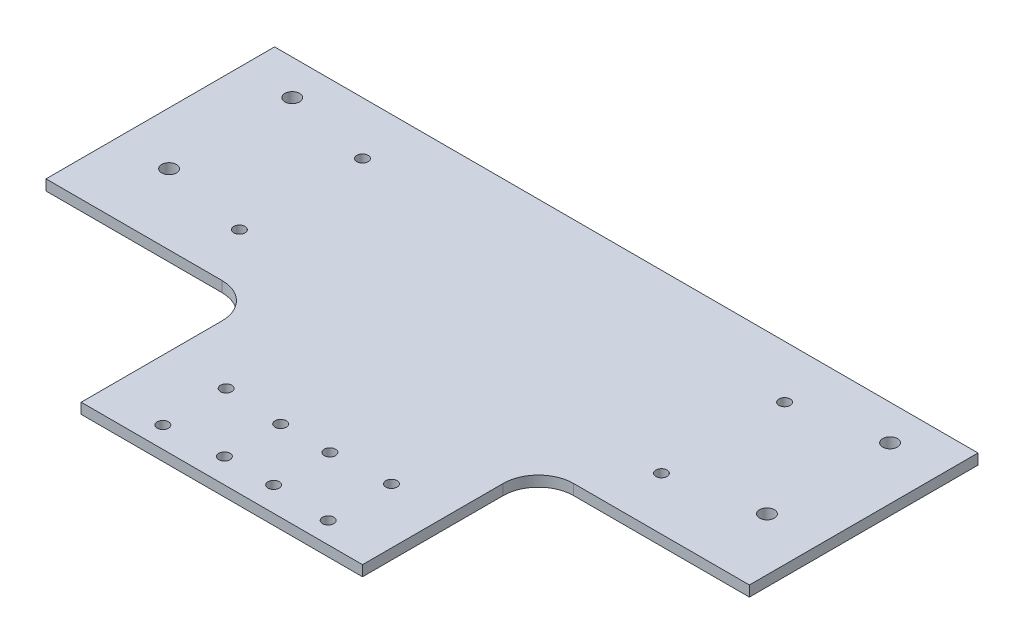
ISO-10303-21;
HEADER;
FILE_DESCRIPTION(('STEP AP214'),'2;1');
FILE_NAME('part.step','',(''),(''),'','','');
FILE_SCHEMA(('AUTOMOTIVE_DESIGN { 1 0 10303 214 1 1 1 1 }'));
ENDSEC;
DATA;
#1=APPLICATION_CONTEXT('core data for automotive mechanical design processes');
#2=APPLICATION_PROTOCOL_DEFINITION('international standard','automotive_design',2000,#1);
#3=PRODUCT_CONTEXT('',#1,'mechanical');
#4=PRODUCT('Part','Part','',(#3));
#5=PRODUCT_RELATED_PRODUCT_CATEGORY('part','',(#4));
#6=PRODUCT_DEFINITION_FORMATION('','',#4);
#7=PRODUCT_DEFINITION_CONTEXT('part definition',#1,'design');
#8=PRODUCT_DEFINITION('design','',#6,#7);
#9=PRODUCT_DEFINITION_SHAPE('','',#8);
#10=(LENGTH_UNIT() NAMED_UNIT(*) SI_UNIT(.MILLI.,.METRE.));
#11=(NAMED_UNIT(*) PLANE_ANGLE_UNIT() SI_UNIT($,.RADIAN.));
#12=(NAMED_UNIT(*) SI_UNIT($,.STERADIAN.) SOLID_ANGLE_UNIT());
#13=UNCERTAINTY_MEASURE_WITH_UNIT(LENGTH_MEASURE(1.E-05),#10,'distance_accuracy_value','');
#14=(GEOMETRIC_REPRESENTATION_CONTEXT(3) GLOBAL_UNCERTAINTY_ASSIGNED_CONTEXT((#13)) GLOBAL_UNIT_ASSIGNED_CONTEXT((#10,
#11,#12)) REPRESENTATION_CONTEXT('',''));
#15=CARTESIAN_POINT('',(0.,0.,0.));
#16=DIRECTION('',(0.,0.,1.));
#17=DIRECTION('',(1.,0.,0.));
#18=AXIS2_PLACEMENT_3D('',#15,#16,#17);
#19=CARTESIAN_POINT('',(0.,3.,32.5));
#20=DIRECTION('',(0.,0.,-1.));
#21=DIRECTION('',(-1.,0.,0.));
#22=AXIS2_PLACEMENT_3D('',#19,#20,#21);
#23=PLANE('',#22);
#24=DIRECTION('',(1.,0.,0.));
#25=VECTOR('',#24,1.);
#26=CARTESIAN_POINT('',(0.,0.,32.5));
#27=LINE('',#26,#25);
#28=CARTESIAN_POINT('',(-100.,0.,32.5));
#29=VERTEX_POINT('',#28);
#30=CARTESIAN_POINT('',(-50.,0.,32.5));
#31=VERTEX_POINT('',#30);
#32=EDGE_CURVE('E168',#29,#31,#27,.T.);
#33=ORIENTED_EDGE('',*,*,#32,.T.);
#34=DIRECTION('',(0.,-1.,0.));
#35=VECTOR('',#34,1.);
#36=CARTESIAN_POINT('',(-50.,3.,32.5));
#37=LINE('',#36,#35);
#38=CARTESIAN_POINT('',(-50.,3.,32.5));
#39=VERTEX_POINT('',#38);
#40=EDGE_CURVE('E52',#31,#39,#37,.F.);
#41=ORIENTED_EDGE('',*,*,#40,.T.);
#42=DIRECTION('',(1.,0.,0.));
#43=VECTOR('',#42,1.);
#44=CARTESIAN_POINT('',(0.,3.,32.5));
#45=LINE('',#44,#43);
#46=CARTESIAN_POINT('',(-100.,3.,32.5));
#47=VERTEX_POINT('',#46);
#48=EDGE_CURVE('E126',#47,#39,#45,.T.);
#49=ORIENTED_EDGE('',*,*,#48,.F.);
#50=DIRECTION('',(0.,-1.,0.));
#51=VECTOR('',#50,1.);
#52=CARTESIAN_POINT('',(-100.,3.,32.5));
#53=LINE('',#52,#51);
#54=EDGE_CURVE('E157',#47,#29,#53,.T.);
#55=ORIENTED_EDGE('',*,*,#54,.T.);
#56=EDGE_LOOP('',(#33,#41,#49,#55));
#57=FACE_BOUND('',#56,.T.);
#58=ADVANCED_FACE('F37',(#57),#23,.F.);
#59=CARTESIAN_POINT('',(-40.,3.,0.));
#60=DIRECTION('',(1.,0.,0.));
#61=DIRECTION('',(0.,0.,-1.));
#62=AXIS2_PLACEMENT_3D('',#59,#60,#61);
#63=PLANE('',#62);
#64=DIRECTION('',(0.,0.,1.));
#65=VECTOR('',#64,1.);
#66=CARTESIAN_POINT('',(-40.,3.,0.));
#67=LINE('',#66,#65);
#68=CARTESIAN_POINT('',(-40.,3.,42.5));
#69=VERTEX_POINT('',#68);
#70=CARTESIAN_POINT('',(-39.9999999999999,3.,82.5));
#71=VERTEX_POINT('',#70);
#72=EDGE_CURVE('E114',#69,#71,#67,.T.);
#73=ORIENTED_EDGE('',*,*,#72,.F.);
#74=DIRECTION('',(0.,-1.,0.));
#75=VECTOR('',#74,1.);
#76=CARTESIAN_POINT('',(-40.,0.,42.5));
#77=LINE('',#76,#75);
#78=CARTESIAN_POINT('',(-40.,0.,42.5));
#79=VERTEX_POINT('',#78);
#80=EDGE_CURVE('E202',#69,#79,#77,.T.);
#81=ORIENTED_EDGE('',*,*,#80,.T.);
#82=DIRECTION('',(0.,0.,1.));
#83=VECTOR('',#82,1.);
#84=CARTESIAN_POINT('',(-40.,0.,0.));
#85=LINE('',#84,#83);
#86=CARTESIAN_POINT('',(-39.9999999999999,0.,82.5));
#87=VERTEX_POINT('',#86);
#88=EDGE_CURVE('E131',#79,#87,#85,.T.);
#89=ORIENTED_EDGE('',*,*,#88,.T.);
#90=DIRECTION('',(0.,-1.,0.));
#91=VECTOR('',#90,1.);
#92=CARTESIAN_POINT('',(-39.9999999999999,3.,82.5));
#93=LINE('',#92,#91);
#94=EDGE_CURVE('E129',#71,#87,#93,.T.);
#95=ORIENTED_EDGE('',*,*,#94,.F.);
#96=EDGE_LOOP('',(#73,#81,#89,#95));
#97=FACE_BOUND('',#96,.T.);
#98=ADVANCED_FACE('F130',(#97),#63,.F.);
#99=CARTESIAN_POINT('',(0.,3.,82.5));
#100=DIRECTION('',(0.,0.,-1.));
#101=DIRECTION('',(-1.,0.,0.));
#102=AXIS2_PLACEMENT_3D('',#99,#100,#101);
#103=PLANE('',#102);
#104=DIRECTION('',(1.,0.,0.));
#105=VECTOR('',#104,1.);
#106=CARTESIAN_POINT('',(0.,0.,82.5));
#107=LINE('',#106,#105);
#108=CARTESIAN_POINT('',(40.0000000000001,0.,82.5));
#109=VERTEX_POINT('',#108);
#110=EDGE_CURVE('E172',#87,#109,#107,.T.);
#111=ORIENTED_EDGE('',*,*,#110,.T.);
#112=DIRECTION('',(0.,-1.,0.));
#113=VECTOR('',#112,1.);
#114=CARTESIAN_POINT('',(40.0000000000001,3.,82.5));
#115=LINE('',#114,#113);
#116=CARTESIAN_POINT('',(40.0000000000001,3.,82.5));
#117=VERTEX_POINT('',#116);
#118=EDGE_CURVE('E136',#117,#109,#115,.T.);
#119=ORIENTED_EDGE('',*,*,#118,.F.);
#120=DIRECTION('',(1.,0.,0.));
#121=VECTOR('',#120,1.);
#122=CARTESIAN_POINT('',(0.,3.,82.5));
#123=LINE('',#122,#121);
#124=EDGE_CURVE('E120',#71,#117,#123,.T.);
#125=ORIENTED_EDGE('',*,*,#124,.F.);
#126=ORIENTED_EDGE('',*,*,#94,.T.);
#127=EDGE_LOOP('',(#111,#119,#125,#126));
#128=FACE_BOUND('',#127,.T.);
#129=ADVANCED_FACE('F138',(#128),#103,.F.);
#130=CARTESIAN_POINT('',(39.9999999999999,3.,0.));
#131=DIRECTION('',(1.,0.,0.));
#132=DIRECTION('',(0.,0.,-1.));
#133=AXIS2_PLACEMENT_3D('',#130,#131,#132);
#134=PLANE('',#133);
#135=DIRECTION('',(0.,0.,1.));
#136=VECTOR('',#135,1.);
#137=CARTESIAN_POINT('',(39.9999999999999,0.,0.));
#138=LINE('',#137,#136);
#139=CARTESIAN_POINT('',(40.,0.,42.5));
#140=VERTEX_POINT('',#139);
#141=EDGE_CURVE('E174',#140,#109,#138,.T.);
#142=ORIENTED_EDGE('',*,*,#141,.F.);
#143=DIRECTION('',(0.,-1.,0.));
#144=VECTOR('',#143,1.);
#145=CARTESIAN_POINT('',(40.,3.,42.5));
#146=LINE('',#145,#144);
#147=CARTESIAN_POINT('',(40.,3.,42.5));
#148=VERTEX_POINT('',#147);
#149=EDGE_CURVE('E200',#140,#148,#146,.F.);
#150=ORIENTED_EDGE('',*,*,#149,.T.);
#151=DIRECTION('',(0.,0.,1.));
#152=VECTOR('',#151,1.);
#153=CARTESIAN_POINT('',(39.9999999999999,3.,0.));
#154=LINE('',#153,#152);
#155=EDGE_CURVE('E140',#148,#117,#154,.T.);
#156=ORIENTED_EDGE('',*,*,#155,.T.);
#157=ORIENTED_EDGE('',*,*,#118,.T.);
#158=EDGE_LOOP('',(#142,#150,#156,#157));
#159=FACE_BOUND('',#158,.T.);
#160=ADVANCED_FACE('F224',(#159),#134,.T.);
#161=CARTESIAN_POINT('',(50.,3.,32.5));
#162=VERTEX_POINT('',#161);
#163=CARTESIAN_POINT('',(100.,3.,32.5));
#164=VERTEX_POINT('',#163);
#165=EDGE_CURVE('E142',#162,#164,#45,.T.);
#166=ORIENTED_EDGE('',*,*,#165,.F.);
#167=DIRECTION('',(0.,-1.,0.));
#168=VECTOR('',#167,1.);
#169=CARTESIAN_POINT('',(50.,3.,32.5));
#170=LINE('',#169,#168);
#171=CARTESIAN_POINT('',(50.,0.,32.5));
#172=VERTEX_POINT('',#171);
#173=EDGE_CURVE('E135',#162,#172,#170,.T.);
#174=ORIENTED_EDGE('',*,*,#173,.T.);
#175=CARTESIAN_POINT('',(100.,0.,32.5));
#176=VERTEX_POINT('',#175);
#177=EDGE_CURVE('E170',#172,#176,#27,.T.);
#178=ORIENTED_EDGE('',*,*,#177,.T.);
#179=DIRECTION('',(0.,-1.,0.));
#180=VECTOR('',#179,1.);
#181=CARTESIAN_POINT('',(100.,3.,32.5));
#182=LINE('',#181,#180);
#183=EDGE_CURVE('E194',#164,#176,#182,.T.);
#184=ORIENTED_EDGE('',*,*,#183,.F.);
#185=EDGE_LOOP('',(#166,#174,#178,#184));
#186=FACE_BOUND('',#185,.T.);
#187=ADVANCED_FACE('F215',(#186),#23,.F.);
#188=CARTESIAN_POINT('',(100.,3.,0.));
#189=DIRECTION('',(-1.,0.,0.));
#190=DIRECTION('',(0.,0.,1.));
#191=AXIS2_PLACEMENT_3D('',#188,#189,#190);
#192=PLANE('',#191);
#193=DIRECTION('',(0.,0.,-1.));
#194=VECTOR('',#193,1.);
#195=CARTESIAN_POINT('',(100.,0.,0.));
#196=LINE('',#195,#194);
#197=CARTESIAN_POINT('',(100.,0.,-32.5));
#198=VERTEX_POINT('',#197);
#199=EDGE_CURVE('E176',#176,#198,#196,.T.);
#200=ORIENTED_EDGE('',*,*,#199,.T.);
#201=DIRECTION('',(0.,-1.,0.));
#202=VECTOR('',#201,1.);
#203=CARTESIAN_POINT('',(100.,3.,-32.5));
#204=LINE('',#203,#202);
#205=CARTESIAN_POINT('',(100.,3.,-32.5));
#206=VERTEX_POINT('',#205);
#207=EDGE_CURVE('E192',#206,#198,#204,.T.);
#208=ORIENTED_EDGE('',*,*,#207,.F.);
#209=DIRECTION('',(0.,0.,-1.));
#210=VECTOR('',#209,1.);
#211=CARTESIAN_POINT('',(100.,3.,0.));
#212=LINE('',#211,#210);
#213=EDGE_CURVE('E146',#164,#206,#212,.T.);
#214=ORIENTED_EDGE('',*,*,#213,.F.);
#215=ORIENTED_EDGE('',*,*,#183,.T.);
#216=EDGE_LOOP('',(#200,#208,#214,#215));
#217=FACE_BOUND('',#216,.T.);
#218=ADVANCED_FACE('F231',(#217),#192,.F.);
#219=CARTESIAN_POINT('',(0.,3.,-32.5));
#220=DIRECTION('',(0.,0.,-1.));
#221=DIRECTION('',(-1.,0.,0.));
#222=AXIS2_PLACEMENT_3D('',#219,#220,#221);
#223=PLANE('',#222);
#224=DIRECTION('',(1.,0.,0.));
#225=VECTOR('',#224,1.);
#226=CARTESIAN_POINT('',(0.,0.,-32.5));
#227=LINE('',#226,#225);
#228=CARTESIAN_POINT('',(-100.,0.,-32.5));
#229=VERTEX_POINT('',#228);
#230=EDGE_CURVE('E179',#229,#198,#227,.T.);
#231=ORIENTED_EDGE('',*,*,#230,.F.);
#232=DIRECTION('',(0.,-1.,0.));
#233=VECTOR('',#232,1.);
#234=CARTESIAN_POINT('',(-100.,3.,-32.5));
#235=LINE('',#234,#233);
#236=CARTESIAN_POINT('',(-100.,3.,-32.5));
#237=VERTEX_POINT('',#236);
#238=EDGE_CURVE('E190',#237,#229,#235,.T.);
#239=ORIENTED_EDGE('',*,*,#238,.F.);
#240=DIRECTION('',(1.,0.,0.));
#241=VECTOR('',#240,1.);
#242=CARTESIAN_POINT('',(0.,3.,-32.5));
#243=LINE('',#242,#241);
#244=EDGE_CURVE('E148',#237,#206,#243,.T.);
#245=ORIENTED_EDGE('',*,*,#244,.T.);
#246=ORIENTED_EDGE('',*,*,#207,.T.);
#247=EDGE_LOOP('',(#231,#239,#245,#246));
#248=FACE_BOUND('',#247,.T.);
#249=ADVANCED_FACE('F242',(#248),#223,.T.);
#250=CARTESIAN_POINT('',(-100.,3.,0.));
#251=DIRECTION('',(-1.,0.,0.));
#252=DIRECTION('',(0.,0.,1.));
#253=AXIS2_PLACEMENT_3D('',#250,#251,#252);
#254=PLANE('',#253);
#255=DIRECTION('',(0.,0.,-1.));
#256=VECTOR('',#255,1.);
#257=CARTESIAN_POINT('',(-100.,0.,0.));
#258=LINE('',#257,#256);
#259=EDGE_CURVE('E182',#29,#229,#258,.T.);
#260=ORIENTED_EDGE('',*,*,#259,.F.);
#261=ORIENTED_EDGE('',*,*,#54,.F.);
#262=DIRECTION('',(0.,0.,-1.));
#263=VECTOR('',#262,1.);
#264=CARTESIAN_POINT('',(-100.,3.,0.));
#265=LINE('',#264,#263);
#266=EDGE_CURVE('E151',#47,#237,#265,.T.);
#267=ORIENTED_EDGE('',*,*,#266,.T.);
#268=ORIENTED_EDGE('',*,*,#238,.T.);
#269=EDGE_LOOP('',(#260,#261,#267,#268));
#270=FACE_BOUND('',#269,.T.);
#271=ADVANCED_FACE('F246',(#270),#254,.T.);
#272=CARTESIAN_POINT('',(-85.,3.,-22.5));
#273=DIRECTION('',(0.,-1.,0.));
#274=DIRECTION('',(0.,0.,-1.));
#275=AXIS2_PLACEMENT_3D('',#272,#273,#274);
#276=CYLINDRICAL_SURFACE('',#275,2.1);
#277=CARTESIAN_POINT('',(-85.,3.,-22.5));
#278=DIRECTION('',(0.,1.,0.));
#279=DIRECTION('',(0.,0.,1.));
#280=AXIS2_PLACEMENT_3D('',#277,#278,#279);
#281=CIRCLE('',#280,2.1);
#282=CARTESIAN_POINT('',(-85.,3.,-20.4));
#283=VERTEX_POINT('',#282);
#284=EDGE_CURVE('E393',#283,#283,#281,.T.);
#285=ORIENTED_EDGE('',*,*,#284,.T.);
#286=EDGE_LOOP('',(#285));
#287=FACE_BOUND('',#286,.T.);
#288=CARTESIAN_POINT('',(-85.,0.,-22.5));
#289=DIRECTION('',(0.,1.,0.));
#290=DIRECTION('',(0.,0.,1.));
#291=AXIS2_PLACEMENT_3D('',#288,#289,#290);
#292=CIRCLE('',#291,2.1);
#293=CARTESIAN_POINT('',(-85.,0.,-20.4));
#294=VERTEX_POINT('',#293);
#295=EDGE_CURVE('E165',#294,#294,#292,.T.);
#296=ORIENTED_EDGE('',*,*,#295,.F.);
#297=EDGE_LOOP('',(#296));
#298=FACE_BOUND('',#297,.T.);
#299=ADVANCED_FACE('F250',(#287,#298),#276,.F.);
#300=CARTESIAN_POINT('',(-85.,3.,12.5));
#301=DIRECTION('',(0.,-1.,0.));
#302=DIRECTION('',(0.,0.,-1.));
#303=AXIS2_PLACEMENT_3D('',#300,#301,#302);
#304=CYLINDRICAL_SURFACE('',#303,2.1);
#305=CARTESIAN_POINT('',(-85.,3.,12.5));
#306=DIRECTION('',(0.,1.,0.));
#307=DIRECTION('',(0.,0.,1.));
#308=AXIS2_PLACEMENT_3D('',#305,#306,#307);
#309=CIRCLE('',#308,2.1);
#310=CARTESIAN_POINT('',(-85.,3.,14.6));
#311=VERTEX_POINT('',#310);
#312=EDGE_CURVE('E390',#311,#311,#309,.T.);
#313=ORIENTED_EDGE('',*,*,#312,.T.);
#314=EDGE_LOOP('',(#313));
#315=FACE_BOUND('',#314,.T.);
#316=CARTESIAN_POINT('',(-85.,0.,12.5));
#317=DIRECTION('',(0.,1.,0.));
#318=DIRECTION('',(0.,0.,1.));
#319=AXIS2_PLACEMENT_3D('',#316,#317,#318);
#320=CIRCLE('',#319,2.1);
#321=CARTESIAN_POINT('',(-85.,0.,14.6));
#322=VERTEX_POINT('',#321);
#323=EDGE_CURVE('E161',#322,#322,#320,.T.);
#324=ORIENTED_EDGE('',*,*,#323,.F.);
#325=EDGE_LOOP('',(#324));
#326=FACE_BOUND('',#325,.T.);
#327=ADVANCED_FACE('F407',(#315,#326),#304,.F.);
#328=CARTESIAN_POINT('',(85.,3.,12.5));
#329=DIRECTION('',(0.,-1.,0.));
#330=DIRECTION('',(0.,0.,-1.));
#331=AXIS2_PLACEMENT_3D('',#328,#329,#330);
#332=CYLINDRICAL_SURFACE('',#331,2.1);
#333=CARTESIAN_POINT('',(85.,3.,12.5));
#334=DIRECTION('',(0.,1.,0.));
#335=DIRECTION('',(0.,0.,1.));
#336=AXIS2_PLACEMENT_3D('',#333,#334,#335);
#337=CIRCLE('',#336,2.1);
#338=CARTESIAN_POINT('',(85.,3.,14.6));
#339=VERTEX_POINT('',#338);
#340=EDGE_CURVE('E188',#339,#339,#337,.F.);
#341=ORIENTED_EDGE('',*,*,#340,.F.);
#342=EDGE_LOOP('',(#341));
#343=FACE_BOUND('',#342,.T.);
#344=CARTESIAN_POINT('',(85.,0.,12.5));
#345=DIRECTION('',(0.,1.,0.));
#346=DIRECTION('',(0.,0.,1.));
#347=AXIS2_PLACEMENT_3D('',#344,#345,#346);
#348=CIRCLE('',#347,2.1);
#349=CARTESIAN_POINT('',(85.,0.,14.6));
#350=VERTEX_POINT('',#349);
#351=EDGE_CURVE('E158',#350,#350,#348,.F.);
#352=ORIENTED_EDGE('',*,*,#351,.T.);
#353=EDGE_LOOP('',(#352));
#354=FACE_BOUND('',#353,.T.);
#355=ADVANCED_FACE('F255',(#343,#354),#332,.F.);
#356=CARTESIAN_POINT('',(85.,3.,-22.5));
#357=DIRECTION('',(0.,-1.,0.));
#358=DIRECTION('',(0.,0.,-1.));
#359=AXIS2_PLACEMENT_3D('',#356,#357,#358);
#360=CYLINDRICAL_SURFACE('',#359,2.1);
#361=CARTESIAN_POINT('',(85.,3.,-22.5));
#362=DIRECTION('',(0.,1.,0.));
#363=DIRECTION('',(0.,0.,1.));
#364=AXIS2_PLACEMENT_3D('',#361,#362,#363);
#365=CIRCLE('',#364,2.1);
#366=CARTESIAN_POINT('',(85.,3.,-20.4));
#367=VERTEX_POINT('',#366);
#368=EDGE_CURVE('E154',#367,#367,#365,.F.);
#369=ORIENTED_EDGE('',*,*,#368,.F.);
#370=EDGE_LOOP('',(#369));
#371=FACE_BOUND('',#370,.T.);
#372=CARTESIAN_POINT('',(85.,0.,-22.5));
#373=DIRECTION('',(0.,1.,0.));
#374=DIRECTION('',(0.,0.,1.));
#375=AXIS2_PLACEMENT_3D('',#372,#373,#374);
#376=CIRCLE('',#375,2.1);
#377=CARTESIAN_POINT('',(85.,0.,-20.4));
#378=VERTEX_POINT('',#377);
#379=EDGE_CURVE('E185',#378,#378,#376,.F.);
#380=ORIENTED_EDGE('',*,*,#379,.T.);
#381=EDGE_LOOP('',(#380));
#382=FACE_BOUND('',#381,.T.);
#383=ADVANCED_FACE('F252',(#371,#382),#360,.F.);
#384=CARTESIAN_POINT('',(0.,3.,0.));
#385=DIRECTION('',(0.,1.,0.));
#386=DIRECTION('',(0.,0.,1.));
#387=AXIS2_PLACEMENT_3D('',#384,#385,#386);
#388=PLANE('',#387);
#389=CARTESIAN_POINT('',(-6.27393769836776,3.,75.5));
#390=DIRECTION('',(0.,1.,0.));
#391=DIRECTION('',(0.,0.,-1.));
#392=AXIS2_PLACEMENT_3D('',#389,#390,#391);
#393=CIRCLE('',#392,1.60000000000001);
#394=CARTESIAN_POINT('',(-6.27393769836776,3.,73.9));
#395=VERTEX_POINT('',#394);
#396=EDGE_CURVE('E339',#395,#395,#393,.T.);
#397=ORIENTED_EDGE('',*,*,#396,.F.);
#398=EDGE_LOOP('',(#397));
#399=FACE_BOUND('',#398,.T.);
#400=CARTESIAN_POINT('',(7.72606230163224,3.,75.5));
#401=DIRECTION('',(0.,1.,0.));
#402=DIRECTION('',(0.,0.,1.));
#403=AXIS2_PLACEMENT_3D('',#400,#401,#402);
#404=CIRCLE('',#403,1.6);
#405=CARTESIAN_POINT('',(7.72606230163224,3.,77.1));
#406=VERTEX_POINT('',#405);
#407=EDGE_CURVE('E333',#406,#406,#404,.T.);
#408=ORIENTED_EDGE('',*,*,#407,.F.);
#409=EDGE_LOOP('',(#408));
#410=FACE_BOUND('',#409,.T.);
#411=CARTESIAN_POINT('',(7.72606230163224,3.,59.5));
#412=DIRECTION('',(0.,1.,0.));
#413=DIRECTION('',(0.,0.,-1.));
#414=AXIS2_PLACEMENT_3D('',#411,#412,#413);
#415=CIRCLE('',#414,1.6);
#416=CARTESIAN_POINT('',(7.72606230163224,3.,57.9));
#417=VERTEX_POINT('',#416);
#418=EDGE_CURVE('E325',#417,#417,#415,.T.);
#419=ORIENTED_EDGE('',*,*,#418,.F.);
#420=EDGE_LOOP('',(#419));
#421=FACE_BOUND('',#420,.T.);
#422=CARTESIAN_POINT('',(-6.27393769836776,3.,59.5));
#423=DIRECTION('',(0.,1.,0.));
#424=DIRECTION('',(0.,0.,1.));
#425=AXIS2_PLACEMENT_3D('',#422,#423,#424);
#426=CIRCLE('',#425,1.6);
#427=CARTESIAN_POINT('',(-6.27393769836776,3.,61.1));
#428=VERTEX_POINT('',#427);
#429=EDGE_CURVE('E318',#428,#428,#426,.T.);
#430=ORIENTED_EDGE('',*,*,#429,.F.);
#431=EDGE_LOOP('',(#430));
#432=FACE_BOUND('',#431,.T.);
#433=CARTESIAN_POINT('',(-22.7739376983678,3.,76.5));
#434=DIRECTION('',(0.,1.,0.));
#435=DIRECTION('',(0.,0.,-1.));
#436=AXIS2_PLACEMENT_3D('',#433,#434,#435);
#437=CIRCLE('',#436,1.60000000000001);
#438=CARTESIAN_POINT('',(-22.7739376983678,3.,74.9));
#439=VERTEX_POINT('',#438);
#440=EDGE_CURVE('E322',#439,#439,#437,.T.);
#441=ORIENTED_EDGE('',*,*,#440,.F.);
#442=EDGE_LOOP('',(#441));
#443=FACE_BOUND('',#442,.T.);
#444=CARTESIAN_POINT('',(24.2260623016322,3.,76.5));
#445=DIRECTION('',(0.,1.,0.));
#446=DIRECTION('',(0.,0.,1.));
#447=AXIS2_PLACEMENT_3D('',#444,#445,#446);
#448=CIRCLE('',#447,1.60000000000001);
#449=CARTESIAN_POINT('',(24.2260623016322,3.,78.1));
#450=VERTEX_POINT('',#449);
#451=EDGE_CURVE('E352',#450,#450,#448,.T.);
#452=ORIENTED_EDGE('',*,*,#451,.F.);
#453=EDGE_LOOP('',(#452));
#454=FACE_BOUND('',#453,.T.);
#455=CARTESIAN_POINT('',(24.2260623016322,3.,58.5));
#456=DIRECTION('',(0.,1.,0.));
#457=DIRECTION('',(0.,0.,-1.));
#458=AXIS2_PLACEMENT_3D('',#455,#456,#457);
#459=CIRCLE('',#458,1.6);
#460=CARTESIAN_POINT('',(24.2260623016322,3.,56.9));
#461=VERTEX_POINT('',#460);
#462=EDGE_CURVE('E346',#461,#461,#459,.T.);
#463=ORIENTED_EDGE('',*,*,#462,.F.);
#464=EDGE_LOOP('',(#463));
#465=FACE_BOUND('',#464,.T.);
#466=CARTESIAN_POINT('',(-22.7739376983678,3.,58.5));
#467=DIRECTION('',(0.,1.,0.));
#468=DIRECTION('',(0.,0.,1.));
#469=AXIS2_PLACEMENT_3D('',#466,#467,#468);
#470=CIRCLE('',#469,1.6);
#471=CARTESIAN_POINT('',(-22.7739376983678,3.,60.1));
#472=VERTEX_POINT('',#471);
#473=EDGE_CURVE('E345',#472,#472,#470,.T.);
#474=ORIENTED_EDGE('',*,*,#473,.F.);
#475=EDGE_LOOP('',(#474));
#476=FACE_BOUND('',#475,.T.);
#477=CARTESIAN_POINT('',(-60.,3.,17.5));
#478=DIRECTION('',(0.,1.,0.));
#479=DIRECTION('',(0.,0.,1.));
#480=AXIS2_PLACEMENT_3D('',#477,#478,#479);
#481=CIRCLE('',#480,1.6);
#482=CARTESIAN_POINT('',(-60.,3.,19.1));
#483=VERTEX_POINT('',#482);
#484=EDGE_CURVE('E370',#483,#483,#481,.T.);
#485=ORIENTED_EDGE('',*,*,#484,.F.);
#486=EDGE_LOOP('',(#485));
#487=FACE_BOUND('',#486,.T.);
#488=CARTESIAN_POINT('',(60.,3.,17.5));
#489=DIRECTION('',(0.,1.,0.));
#490=DIRECTION('',(0.,0.,1.));
#491=AXIS2_PLACEMENT_3D('',#488,#489,#490);
#492=CIRCLE('',#491,1.6);
#493=CARTESIAN_POINT('',(60.,3.,19.1));
#494=VERTEX_POINT('',#493);
#495=EDGE_CURVE('E376',#494,#494,#492,.T.);
#496=ORIENTED_EDGE('',*,*,#495,.F.);
#497=EDGE_LOOP('',(#496));
#498=FACE_BOUND('',#497,.T.);
#499=CARTESIAN_POINT('',(60.,3.,-17.5));
#500=DIRECTION('',(0.,1.,0.));
#501=DIRECTION('',(0.,0.,1.));
#502=AXIS2_PLACEMENT_3D('',#499,#500,#501);
#503=CIRCLE('',#502,1.6);
#504=CARTESIAN_POINT('',(60.,3.,-15.9));
#505=VERTEX_POINT('',#504);
#506=EDGE_CURVE('E363',#505,#505,#503,.T.);
#507=ORIENTED_EDGE('',*,*,#506,.F.);
#508=EDGE_LOOP('',(#507));
#509=FACE_BOUND('',#508,.T.);
#510=CARTESIAN_POINT('',(-60.,3.,-17.5));
#511=DIRECTION('',(0.,1.,0.));
#512=DIRECTION('',(0.,0.,1.));
#513=AXIS2_PLACEMENT_3D('',#510,#511,#512);
#514=CIRCLE('',#513,1.6);
#515=CARTESIAN_POINT('',(-60.,3.,-15.9));
#516=VERTEX_POINT('',#515);
#517=EDGE_CURVE('E369',#516,#516,#514,.T.);
#518=ORIENTED_EDGE('',*,*,#517,.F.);
#519=EDGE_LOOP('',(#518));
#520=FACE_BOUND('',#519,.T.);
#521=ORIENTED_EDGE('',*,*,#340,.T.);
#522=EDGE_LOOP('',(#521));
#523=FACE_BOUND('',#522,.T.);
#524=ORIENTED_EDGE('',*,*,#312,.F.);
#525=EDGE_LOOP('',(#524));
#526=FACE_BOUND('',#525,.T.);
#527=ORIENTED_EDGE('',*,*,#284,.F.);
#528=EDGE_LOOP('',(#527));
#529=FACE_BOUND('',#528,.T.);
#530=ORIENTED_EDGE('',*,*,#48,.T.);
#531=CARTESIAN_POINT('',(-50.,3.,42.5));
#532=DIRECTION('',(0.,1.,0.));
#533=DIRECTION('',(0.,0.,1.));
#534=AXIS2_PLACEMENT_3D('',#531,#532,#533);
#535=CIRCLE('',#534,10.);
#536=EDGE_CURVE('E11',#39,#69,#535,.F.);
#537=ORIENTED_EDGE('',*,*,#536,.T.);
#538=ORIENTED_EDGE('',*,*,#72,.T.);
#539=ORIENTED_EDGE('',*,*,#124,.T.);
#540=ORIENTED_EDGE('',*,*,#155,.F.);
#541=CARTESIAN_POINT('',(50.,3.,42.5));
#542=DIRECTION('',(0.,1.,0.));
#543=DIRECTION('',(0.,0.,1.));
#544=AXIS2_PLACEMENT_3D('',#541,#542,#543);
#545=CIRCLE('',#544,10.);
#546=EDGE_CURVE('E207',#148,#162,#545,.F.);
#547=ORIENTED_EDGE('',*,*,#546,.T.);
#548=ORIENTED_EDGE('',*,*,#165,.T.);
#549=ORIENTED_EDGE('',*,*,#213,.T.);
#550=ORIENTED_EDGE('',*,*,#244,.F.);
#551=ORIENTED_EDGE('',*,*,#266,.F.);
#552=EDGE_LOOP('',(#530,#537,#538,#539,#540,#547,#548,#549,#550,#551));
#553=FACE_BOUND('',#552,.T.);
#554=ORIENTED_EDGE('',*,*,#368,.T.);
#555=EDGE_LOOP('',(#554));
#556=FACE_BOUND('',#555,.T.);
#557=ADVANCED_FACE('F116',(#399,#410,#421,#432,#443,#454,#465,#476,#487,#498,#509,#520,#523,
#526,#529,#553,#556),#388,.T.);
#558=CARTESIAN_POINT('',(0.,0.,0.));
#559=DIRECTION('',(0.,1.,0.));
#560=DIRECTION('',(0.,0.,1.));
#561=AXIS2_PLACEMENT_3D('',#558,#559,#560);
#562=PLANE('',#561);
#563=CARTESIAN_POINT('',(-6.27393769836776,0.,75.5));
#564=DIRECTION('',(0.,1.,0.));
#565=DIRECTION('',(0.,0.,-1.));
#566=AXIS2_PLACEMENT_3D('',#563,#564,#565);
#567=CIRCLE('',#566,1.60000000000001);
#568=CARTESIAN_POINT('',(-6.27393769836776,0.,73.9));
#569=VERTEX_POINT('',#568);
#570=EDGE_CURVE('E336',#569,#569,#567,.T.);
#571=ORIENTED_EDGE('',*,*,#570,.T.);
#572=EDGE_LOOP('',(#571));
#573=FACE_BOUND('',#572,.T.);
#574=CARTESIAN_POINT('',(7.72606230163224,0.,75.5));
#575=DIRECTION('',(0.,1.,0.));
#576=DIRECTION('',(0.,0.,1.));
#577=AXIS2_PLACEMENT_3D('',#574,#575,#576);
#578=CIRCLE('',#577,1.6);
#579=CARTESIAN_POINT('',(7.72606230163224,0.,77.1));
#580=VERTEX_POINT('',#579);
#581=EDGE_CURVE('E330',#580,#580,#578,.T.);
#582=ORIENTED_EDGE('',*,*,#581,.T.);
#583=EDGE_LOOP('',(#582));
#584=FACE_BOUND('',#583,.T.);
#585=CARTESIAN_POINT('',(7.72606230163224,0.,59.5));
#586=DIRECTION('',(0.,1.,0.));
#587=DIRECTION('',(0.,0.,-1.));
#588=AXIS2_PLACEMENT_3D('',#585,#586,#587);
#589=CIRCLE('',#588,1.6);
#590=CARTESIAN_POINT('',(7.72606230163224,0.,57.9));
#591=VERTEX_POINT('',#590);
#592=EDGE_CURVE('E320',#591,#591,#589,.T.);
#593=ORIENTED_EDGE('',*,*,#592,.T.);
#594=EDGE_LOOP('',(#593));
#595=FACE_BOUND('',#594,.T.);
#596=CARTESIAN_POINT('',(-6.27393769836776,0.,59.5));
#597=DIRECTION('',(0.,1.,0.));
#598=DIRECTION('',(0.,0.,1.));
#599=AXIS2_PLACEMENT_3D('',#596,#597,#598);
#600=CIRCLE('',#599,1.6);
#601=CARTESIAN_POINT('',(-6.27393769836776,0.,61.1));
#602=VERTEX_POINT('',#601);
#603=EDGE_CURVE('E315',#602,#602,#600,.T.);
#604=ORIENTED_EDGE('',*,*,#603,.T.);
#605=EDGE_LOOP('',(#604));
#606=FACE_BOUND('',#605,.T.);
#607=CARTESIAN_POINT('',(-22.7739376983678,0.,76.5));
#608=DIRECTION('',(0.,1.,0.));
#609=DIRECTION('',(0.,0.,-1.));
#610=AXIS2_PLACEMENT_3D('',#607,#608,#609);
#611=CIRCLE('',#610,1.60000000000001);
#612=CARTESIAN_POINT('',(-22.7739376983678,0.,74.9));
#613=VERTEX_POINT('',#612);
#614=EDGE_CURVE('E355',#613,#613,#611,.T.);
#615=ORIENTED_EDGE('',*,*,#614,.T.);
#616=EDGE_LOOP('',(#615));
#617=FACE_BOUND('',#616,.T.);
#618=CARTESIAN_POINT('',(24.2260623016322,0.,76.5));
#619=DIRECTION('',(0.,1.,0.));
#620=DIRECTION('',(0.,0.,1.));
#621=AXIS2_PLACEMENT_3D('',#618,#619,#620);
#622=CIRCLE('',#621,1.60000000000001);
#623=CARTESIAN_POINT('',(24.2260623016322,0.,78.1));
#624=VERTEX_POINT('',#623);
#625=EDGE_CURVE('E349',#624,#624,#622,.T.);
#626=ORIENTED_EDGE('',*,*,#625,.T.);
#627=EDGE_LOOP('',(#626));
#628=FACE_BOUND('',#627,.T.);
#629=CARTESIAN_POINT('',(24.2260623016322,0.,58.5));
#630=DIRECTION('',(0.,1.,0.));
#631=DIRECTION('',(0.,0.,-1.));
#632=AXIS2_PLACEMENT_3D('',#629,#630,#631);
#633=CIRCLE('',#632,1.6);
#634=CARTESIAN_POINT('',(24.2260623016322,0.,56.9));
#635=VERTEX_POINT('',#634);
#636=EDGE_CURVE('E342',#635,#635,#633,.T.);
#637=ORIENTED_EDGE('',*,*,#636,.T.);
#638=EDGE_LOOP('',(#637));
#639=FACE_BOUND('',#638,.T.);
#640=CARTESIAN_POINT('',(-22.7739376983678,0.,58.5));
#641=DIRECTION('',(0.,1.,0.));
#642=DIRECTION('',(0.,0.,1.));
#643=AXIS2_PLACEMENT_3D('',#640,#641,#642);
#644=CIRCLE('',#643,1.6);
#645=CARTESIAN_POINT('',(-22.7739376983678,0.,60.1));
#646=VERTEX_POINT('',#645);
#647=EDGE_CURVE('E360',#646,#646,#644,.T.);
#648=ORIENTED_EDGE('',*,*,#647,.T.);
#649=EDGE_LOOP('',(#648));
#650=FACE_BOUND('',#649,.T.);
#651=CARTESIAN_POINT('',(-60.,0.,17.5));
#652=DIRECTION('',(0.,1.,0.));
#653=DIRECTION('',(0.,0.,1.));
#654=AXIS2_PLACEMENT_3D('',#651,#652,#653);
#655=CIRCLE('',#654,1.6);
#656=CARTESIAN_POINT('',(-60.,0.,19.1));
#657=VERTEX_POINT('',#656);
#658=EDGE_CURVE('E366',#657,#657,#655,.T.);
#659=ORIENTED_EDGE('',*,*,#658,.T.);
#660=EDGE_LOOP('',(#659));
#661=FACE_BOUND('',#660,.T.);
#662=CARTESIAN_POINT('',(60.,0.,17.5));
#663=DIRECTION('',(0.,1.,0.));
#664=DIRECTION('',(0.,0.,1.));
#665=AXIS2_PLACEMENT_3D('',#662,#663,#664);
#666=CIRCLE('',#665,1.6);
#667=CARTESIAN_POINT('',(60.,0.,19.1));
#668=VERTEX_POINT('',#667);
#669=EDGE_CURVE('E373',#668,#668,#666,.T.);
#670=ORIENTED_EDGE('',*,*,#669,.T.);
#671=EDGE_LOOP('',(#670));
#672=FACE_BOUND('',#671,.T.);
#673=CARTESIAN_POINT('',(60.,0.,-17.5));
#674=DIRECTION('',(0.,1.,0.));
#675=DIRECTION('',(0.,0.,1.));
#676=AXIS2_PLACEMENT_3D('',#673,#674,#675);
#677=CIRCLE('',#676,1.6);
#678=CARTESIAN_POINT('',(60.,0.,-15.9));
#679=VERTEX_POINT('',#678);
#680=EDGE_CURVE('E379',#679,#679,#677,.T.);
#681=ORIENTED_EDGE('',*,*,#680,.T.);
#682=EDGE_LOOP('',(#681));
#683=FACE_BOUND('',#682,.T.);
#684=CARTESIAN_POINT('',(-60.,0.,-17.5));
#685=DIRECTION('',(0.,1.,0.));
#686=DIRECTION('',(0.,0.,1.));
#687=AXIS2_PLACEMENT_3D('',#684,#685,#686);
#688=CIRCLE('',#687,1.6);
#689=CARTESIAN_POINT('',(-60.,0.,-15.9));
#690=VERTEX_POINT('',#689);
#691=EDGE_CURVE('E162',#690,#690,#688,.T.);
#692=ORIENTED_EDGE('',*,*,#691,.T.);
#693=EDGE_LOOP('',(#692));
#694=FACE_BOUND('',#693,.T.);
#695=ORIENTED_EDGE('',*,*,#351,.F.);
#696=EDGE_LOOP('',(#695));
#697=FACE_BOUND('',#696,.T.);
#698=ORIENTED_EDGE('',*,*,#323,.T.);
#699=EDGE_LOOP('',(#698));
#700=FACE_BOUND('',#699,.T.);
#701=ORIENTED_EDGE('',*,*,#295,.T.);
#702=EDGE_LOOP('',(#701));
#703=FACE_BOUND('',#702,.T.);
#704=ORIENTED_EDGE('',*,*,#32,.F.);
#705=ORIENTED_EDGE('',*,*,#259,.T.);
#706=ORIENTED_EDGE('',*,*,#230,.T.);
#707=ORIENTED_EDGE('',*,*,#199,.F.);
#708=ORIENTED_EDGE('',*,*,#177,.F.);
#709=CARTESIAN_POINT('',(50.,0.,42.5));
#710=DIRECTION('',(0.,1.,0.));
#711=DIRECTION('',(0.,0.,1.));
#712=AXIS2_PLACEMENT_3D('',#709,#710,#711);
#713=CIRCLE('',#712,10.);
#714=EDGE_CURVE('E205',#172,#140,#713,.T.);
#715=ORIENTED_EDGE('',*,*,#714,.T.);
#716=ORIENTED_EDGE('',*,*,#141,.T.);
#717=ORIENTED_EDGE('',*,*,#110,.F.);
#718=ORIENTED_EDGE('',*,*,#88,.F.);
#719=CARTESIAN_POINT('',(-50.,0.,42.5));
#720=DIRECTION('',(0.,1.,0.));
#721=DIRECTION('',(0.,0.,1.));
#722=AXIS2_PLACEMENT_3D('',#719,#720,#721);
#723=CIRCLE('',#722,10.);
#724=EDGE_CURVE('E45',#79,#31,#723,.T.);
#725=ORIENTED_EDGE('',*,*,#724,.T.);
#726=EDGE_LOOP('',(#704,#705,#706,#707,#708,#715,#716,#717,#718,#725));
#727=FACE_BOUND('',#726,.T.);
#728=ORIENTED_EDGE('',*,*,#379,.F.);
#729=EDGE_LOOP('',(#728));
#730=FACE_BOUND('',#729,.T.);
#731=ADVANCED_FACE('F220',(#573,#584,#595,#606,#617,#628,#639,#650,#661,#672,#683,#694,#697,
#700,#703,#727,#730),#562,.F.);
#732=CARTESIAN_POINT('',(-60.,0.,-17.5));
#733=DIRECTION('',(0.,1.,0.));
#734=DIRECTION('',(0.,0.,1.));
#735=AXIS2_PLACEMENT_3D('',#732,#733,#734);
#736=CYLINDRICAL_SURFACE('',#735,1.6);
#737=ORIENTED_EDGE('',*,*,#691,.F.);
#738=EDGE_LOOP('',(#737));
#739=FACE_BOUND('',#738,.T.);
#740=ORIENTED_EDGE('',*,*,#517,.T.);
#741=EDGE_LOOP('',(#740));
#742=FACE_BOUND('',#741,.T.);
#743=ADVANCED_FACE('F259',(#739,#742),#736,.F.);
#744=CARTESIAN_POINT('',(60.,0.,-17.5));
#745=DIRECTION('',(0.,1.,0.));
#746=DIRECTION('',(0.,0.,1.));
#747=AXIS2_PLACEMENT_3D('',#744,#745,#746);
#748=CYLINDRICAL_SURFACE('',#747,1.6);
#749=ORIENTED_EDGE('',*,*,#680,.F.);
#750=EDGE_LOOP('',(#749));
#751=FACE_BOUND('',#750,.T.);
#752=ORIENTED_EDGE('',*,*,#506,.T.);
#753=EDGE_LOOP('',(#752));
#754=FACE_BOUND('',#753,.T.);
#755=ADVANCED_FACE('F266',(#751,#754),#748,.F.);
#756=CARTESIAN_POINT('',(60.,0.,17.5));
#757=DIRECTION('',(0.,1.,0.));
#758=DIRECTION('',(0.,0.,1.));
#759=AXIS2_PLACEMENT_3D('',#756,#757,#758);
#760=CYLINDRICAL_SURFACE('',#759,1.6);
#761=ORIENTED_EDGE('',*,*,#669,.F.);
#762=EDGE_LOOP('',(#761));
#763=FACE_BOUND('',#762,.T.);
#764=ORIENTED_EDGE('',*,*,#495,.T.);
#765=EDGE_LOOP('',(#764));
#766=FACE_BOUND('',#765,.T.);
#767=ADVANCED_FACE('F270',(#763,#766),#760,.F.);
#768=CARTESIAN_POINT('',(-60.,0.,17.5));
#769=DIRECTION('',(0.,1.,0.));
#770=DIRECTION('',(0.,0.,1.));
#771=AXIS2_PLACEMENT_3D('',#768,#769,#770);
#772=CYLINDRICAL_SURFACE('',#771,1.6);
#773=ORIENTED_EDGE('',*,*,#658,.F.);
#774=EDGE_LOOP('',(#773));
#775=FACE_BOUND('',#774,.T.);
#776=ORIENTED_EDGE('',*,*,#484,.T.);
#777=EDGE_LOOP('',(#776));
#778=FACE_BOUND('',#777,.T.);
#779=ADVANCED_FACE('F274',(#775,#778),#772,.F.);
#780=CARTESIAN_POINT('',(-22.7739376983678,0.,58.5));
#781=DIRECTION('',(0.,1.,0.));
#782=DIRECTION('',(0.,0.,1.));
#783=AXIS2_PLACEMENT_3D('',#780,#781,#782);
#784=CYLINDRICAL_SURFACE('',#783,1.6);
#785=ORIENTED_EDGE('',*,*,#647,.F.);
#786=EDGE_LOOP('',(#785));
#787=FACE_BOUND('',#786,.T.);
#788=ORIENTED_EDGE('',*,*,#473,.T.);
#789=EDGE_LOOP('',(#788));
#790=FACE_BOUND('',#789,.T.);
#791=ADVANCED_FACE('F278',(#787,#790),#784,.F.);
#792=CARTESIAN_POINT('',(24.2260623016322,0.,58.5));
#793=DIRECTION('',(0.,1.,0.));
#794=DIRECTION('',(0.,0.,1.));
#795=AXIS2_PLACEMENT_3D('',#792,#793,#794);
#796=CYLINDRICAL_SURFACE('',#795,1.6);
#797=ORIENTED_EDGE('',*,*,#636,.F.);
#798=EDGE_LOOP('',(#797));
#799=FACE_BOUND('',#798,.T.);
#800=ORIENTED_EDGE('',*,*,#462,.T.);
#801=EDGE_LOOP('',(#800));
#802=FACE_BOUND('',#801,.T.);
#803=ADVANCED_FACE('F282',(#799,#802),#796,.F.);
#804=CARTESIAN_POINT('',(24.2260623016322,0.,76.5));
#805=DIRECTION('',(0.,1.,0.));
#806=DIRECTION('',(0.,0.,1.));
#807=AXIS2_PLACEMENT_3D('',#804,#805,#806);
#808=CYLINDRICAL_SURFACE('',#807,1.60000000000001);
#809=ORIENTED_EDGE('',*,*,#625,.F.);
#810=EDGE_LOOP('',(#809));
#811=FACE_BOUND('',#810,.T.);
#812=ORIENTED_EDGE('',*,*,#451,.T.);
#813=EDGE_LOOP('',(#812));
#814=FACE_BOUND('',#813,.T.);
#815=ADVANCED_FACE('F288',(#811,#814),#808,.F.);
#816=CARTESIAN_POINT('',(-22.7739376983678,0.,76.5));
#817=DIRECTION('',(0.,1.,0.));
#818=DIRECTION('',(0.,0.,1.));
#819=AXIS2_PLACEMENT_3D('',#816,#817,#818);
#820=CYLINDRICAL_SURFACE('',#819,1.60000000000001);
#821=ORIENTED_EDGE('',*,*,#614,.F.);
#822=EDGE_LOOP('',(#821));
#823=FACE_BOUND('',#822,.T.);
#824=ORIENTED_EDGE('',*,*,#440,.T.);
#825=EDGE_LOOP('',(#824));
#826=FACE_BOUND('',#825,.T.);
#827=ADVANCED_FACE('F284',(#823,#826),#820,.F.);
#828=CARTESIAN_POINT('',(-6.27393769836776,0.,59.5));
#829=DIRECTION('',(0.,1.,0.));
#830=DIRECTION('',(0.,0.,1.));
#831=AXIS2_PLACEMENT_3D('',#828,#829,#830);
#832=CYLINDRICAL_SURFACE('',#831,1.6);
#833=ORIENTED_EDGE('',*,*,#603,.F.);
#834=EDGE_LOOP('',(#833));
#835=FACE_BOUND('',#834,.T.);
#836=ORIENTED_EDGE('',*,*,#429,.T.);
#837=EDGE_LOOP('',(#836));
#838=FACE_BOUND('',#837,.T.);
#839=ADVANCED_FACE('F287',(#835,#838),#832,.F.);
#840=CARTESIAN_POINT('',(7.72606230163224,0.,59.5));
#841=DIRECTION('',(0.,1.,0.));
#842=DIRECTION('',(0.,0.,1.));
#843=AXIS2_PLACEMENT_3D('',#840,#841,#842);
#844=CYLINDRICAL_SURFACE('',#843,1.6);
#845=ORIENTED_EDGE('',*,*,#592,.F.);
#846=EDGE_LOOP('',(#845));
#847=FACE_BOUND('',#846,.T.);
#848=ORIENTED_EDGE('',*,*,#418,.T.);
#849=EDGE_LOOP('',(#848));
#850=FACE_BOUND('',#849,.T.);
#851=ADVANCED_FACE('F303',(#847,#850),#844,.F.);
#852=CARTESIAN_POINT('',(7.72606230163224,0.,75.5));
#853=DIRECTION('',(0.,1.,0.));
#854=DIRECTION('',(0.,0.,1.));
#855=AXIS2_PLACEMENT_3D('',#852,#853,#854);
#856=CYLINDRICAL_SURFACE('',#855,1.6);
#857=ORIENTED_EDGE('',*,*,#581,.F.);
#858=EDGE_LOOP('',(#857));
#859=FACE_BOUND('',#858,.T.);
#860=ORIENTED_EDGE('',*,*,#407,.T.);
#861=EDGE_LOOP('',(#860));
#862=FACE_BOUND('',#861,.T.);
#863=ADVANCED_FACE('F299',(#859,#862),#856,.F.);
#864=CARTESIAN_POINT('',(-6.27393769836776,0.,75.5));
#865=DIRECTION('',(0.,1.,0.));
#866=DIRECTION('',(0.,0.,1.));
#867=AXIS2_PLACEMENT_3D('',#864,#865,#866);
#868=CYLINDRICAL_SURFACE('',#867,1.60000000000001);
#869=ORIENTED_EDGE('',*,*,#570,.F.);
#870=EDGE_LOOP('',(#869));
#871=FACE_BOUND('',#870,.T.);
#872=ORIENTED_EDGE('',*,*,#396,.T.);
#873=EDGE_LOOP('',(#872));
#874=FACE_BOUND('',#873,.T.);
#875=ADVANCED_FACE('F296',(#871,#874),#868,.F.);
#876=CARTESIAN_POINT('',(50.,3.,42.5));
#877=DIRECTION('',(0.,-1.,0.));
#878=DIRECTION('',(0.,0.,-1.));
#879=AXIS2_PLACEMENT_3D('',#876,#877,#878);
#880=CYLINDRICAL_SURFACE('',#879,10.);
#881=ORIENTED_EDGE('',*,*,#546,.F.);
#882=ORIENTED_EDGE('',*,*,#149,.F.);
#883=ORIENTED_EDGE('',*,*,#714,.F.);
#884=ORIENTED_EDGE('',*,*,#173,.F.);
#885=EDGE_LOOP('',(#881,#882,#883,#884));
#886=FACE_BOUND('',#885,.T.);
#887=ADVANCED_FACE('F218',(#886),#880,.F.);
#888=CARTESIAN_POINT('',(-50.,3.,42.5));
#889=DIRECTION('',(0.,1.,0.));
#890=DIRECTION('',(0.,0.,1.));
#891=AXIS2_PLACEMENT_3D('',#888,#889,#890);
#892=CYLINDRICAL_SURFACE('',#891,10.);
#893=ORIENTED_EDGE('',*,*,#536,.F.);
#894=ORIENTED_EDGE('',*,*,#40,.F.);
#895=ORIENTED_EDGE('',*,*,#724,.F.);
#896=ORIENTED_EDGE('',*,*,#80,.F.);
#897=EDGE_LOOP('',(#893,#894,#895,#896));
#898=FACE_BOUND('',#897,.T.);
#899=ADVANCED_FACE('F39',(#898),#892,.F.);
#900=CLOSED_SHELL('',(#58,#98,#129,#160,#187,#218,#249,#271,#299,#327,#355,#383,#557,#731,#743,
#755,#767,#779,#791,#803,#815,#827,#839,#851,#863,#875,#887,#899));
#901=MANIFOLD_SOLID_BREP('B2',#900);
#902=ADVANCED_BREP_SHAPE_REPRESENTATION('',(#18,#901),#14);
#903=SHAPE_DEFINITION_REPRESENTATION(#9,#902);
ENDSEC;
END-ISO-10303-21;
